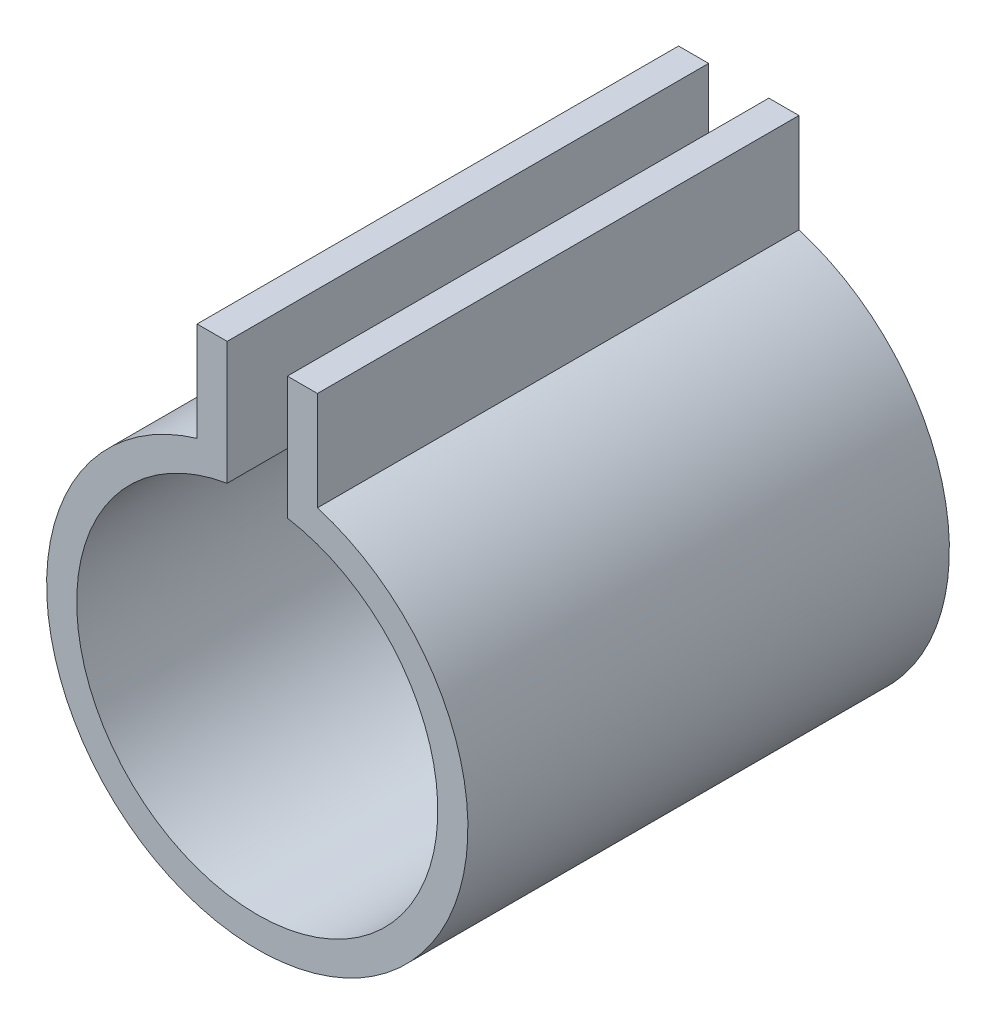
ISO-10303-21;
HEADER;
FILE_DESCRIPTION(('STEP AP214'),'2;1');
FILE_NAME('part.step','',(''),(''),'','','');
FILE_SCHEMA(('AUTOMOTIVE_DESIGN { 1 0 10303 214 1 1 1 1 }'));
ENDSEC;
DATA;
#1=APPLICATION_CONTEXT('core data for automotive mechanical design processes');
#2=APPLICATION_PROTOCOL_DEFINITION('international standard','automotive_design',2000,#1);
#3=PRODUCT_CONTEXT('',#1,'mechanical');
#4=PRODUCT('Part','Part','',(#3));
#5=PRODUCT_RELATED_PRODUCT_CATEGORY('part','',(#4));
#6=PRODUCT_DEFINITION_FORMATION('','',#4);
#7=PRODUCT_DEFINITION_CONTEXT('part definition',#1,'design');
#8=PRODUCT_DEFINITION('design','',#6,#7);
#9=PRODUCT_DEFINITION_SHAPE('','',#8);
#10=(LENGTH_UNIT() NAMED_UNIT(*) SI_UNIT(.MILLI.,.METRE.));
#11=(NAMED_UNIT(*) PLANE_ANGLE_UNIT() SI_UNIT($,.RADIAN.));
#12=(NAMED_UNIT(*) SI_UNIT($,.STERADIAN.) SOLID_ANGLE_UNIT());
#13=UNCERTAINTY_MEASURE_WITH_UNIT(LENGTH_MEASURE(1.E-05),#10,'distance_accuracy_value','');
#14=(GEOMETRIC_REPRESENTATION_CONTEXT(3) GLOBAL_UNCERTAINTY_ASSIGNED_CONTEXT((#13)) GLOBAL_UNIT_ASSIGNED_CONTEXT((#10,
#11,#12)) REPRESENTATION_CONTEXT('',''));
#15=CARTESIAN_POINT('',(0.,0.,0.));
#16=DIRECTION('',(0.,0.,1.));
#17=DIRECTION('',(1.,0.,0.));
#18=AXIS2_PLACEMENT_3D('',#15,#16,#17);
#19=CARTESIAN_POINT('',(-3.175,31.75,50.8));
#20=DIRECTION('',(0.,-1.,0.));
#21=DIRECTION('',(0.,0.,-1.));
#22=AXIS2_PLACEMENT_3D('',#19,#20,#21);
#23=PLANE('',#22);
#24=DIRECTION('',(-1.,0.,0.));
#25=VECTOR('',#24,1.);
#26=CARTESIAN_POINT('',(-3.175,31.75,0.));
#27=LINE('',#26,#25);
#28=CARTESIAN_POINT('',(-3.175,31.75,0.));
#29=VERTEX_POINT('',#28);
#30=CARTESIAN_POINT('',(-6.35,31.75,0.));
#31=VERTEX_POINT('',#30);
#32=EDGE_CURVE('E158',#29,#31,#27,.T.);
#33=ORIENTED_EDGE('',*,*,#32,.T.);
#34=DIRECTION('',(0.,0.,-1.));
#35=VECTOR('',#34,1.);
#36=CARTESIAN_POINT('',(-6.35,31.75,50.8));
#37=LINE('',#36,#35);
#38=CARTESIAN_POINT('',(-6.35,31.75,50.8));
#39=VERTEX_POINT('',#38);
#40=EDGE_CURVE('E11',#39,#31,#37,.T.);
#41=ORIENTED_EDGE('',*,*,#40,.F.);
#42=DIRECTION('',(-1.,0.,0.));
#43=VECTOR('',#42,1.);
#44=CARTESIAN_POINT('',(-3.175,31.75,50.8));
#45=LINE('',#44,#43);
#46=CARTESIAN_POINT('',(-3.175,31.75,50.8));
#47=VERTEX_POINT('',#46);
#48=EDGE_CURVE('E181',#47,#39,#45,.T.);
#49=ORIENTED_EDGE('',*,*,#48,.F.);
#50=DIRECTION('',(0.,0.,-1.));
#51=VECTOR('',#50,1.);
#52=CARTESIAN_POINT('',(-3.175,31.75,50.8));
#53=LINE('',#52,#51);
#54=EDGE_CURVE('E154',#47,#29,#53,.T.);
#55=ORIENTED_EDGE('',*,*,#54,.T.);
#56=EDGE_LOOP('',(#33,#41,#49,#55));
#57=FACE_BOUND('',#56,.T.);
#58=ADVANCED_FACE('F39',(#57),#23,.F.);
#59=CARTESIAN_POINT('',(-6.35,31.75,50.8));
#60=DIRECTION('',(1.,0.,0.));
#61=DIRECTION('',(0.,1.,0.));
#62=AXIS2_PLACEMENT_3D('',#59,#60,#61);
#63=PLANE('',#62);
#64=DIRECTION('',(0.,-1.,0.));
#65=VECTOR('',#64,1.);
#66=CARTESIAN_POINT('',(-6.35,31.75,0.));
#67=LINE('',#66,#65);
#68=CARTESIAN_POINT('',(-6.35,21.2985474856855,0.));
#69=VERTEX_POINT('',#68);
#70=EDGE_CURVE('E162',#31,#69,#67,.T.);
#71=ORIENTED_EDGE('',*,*,#70,.T.);
#72=DIRECTION('',(0.,0.,-1.));
#73=VECTOR('',#72,1.);
#74=CARTESIAN_POINT('',(-6.35,21.2985474856855,50.8));
#75=LINE('',#74,#73);
#76=CARTESIAN_POINT('',(-6.35,21.2985474856855,50.8));
#77=VERTEX_POINT('',#76);
#78=EDGE_CURVE('E48',#77,#69,#75,.T.);
#79=ORIENTED_EDGE('',*,*,#78,.F.);
#80=DIRECTION('',(0.,-1.,0.));
#81=VECTOR('',#80,1.);
#82=CARTESIAN_POINT('',(-6.35,31.75,50.8));
#83=LINE('',#82,#81);
#84=EDGE_CURVE('E110',#39,#77,#83,.T.);
#85=ORIENTED_EDGE('',*,*,#84,.F.);
#86=ORIENTED_EDGE('',*,*,#40,.T.);
#87=EDGE_LOOP('',(#71,#79,#85,#86));
#88=FACE_BOUND('',#87,.T.);
#89=ADVANCED_FACE('F224',(#88),#63,.F.);
#90=CARTESIAN_POINT('',(0.,0.,50.8));
#91=DIRECTION('',(0.,0.,-1.));
#92=DIRECTION('',(-1.,0.,0.));
#93=AXIS2_PLACEMENT_3D('',#90,#91,#92);
#94=CYLINDRICAL_SURFACE('',#93,22.225);
#95=CARTESIAN_POINT('',(0.,0.,0.));
#96=DIRECTION('',(0.,0.,1.));
#97=DIRECTION('',(1.,0.,0.));
#98=AXIS2_PLACEMENT_3D('',#95,#96,#97);
#99=CIRCLE('',#98,22.225);
#100=CARTESIAN_POINT('',(6.35000000000001,21.2985474856855,0.));
#101=VERTEX_POINT('',#100);
#102=EDGE_CURVE('E165',#69,#101,#99,.T.);
#103=ORIENTED_EDGE('',*,*,#102,.T.);
#104=DIRECTION('',(0.,0.,-1.));
#105=VECTOR('',#104,1.);
#106=CARTESIAN_POINT('',(6.35000000000001,21.2985474856855,50.8));
#107=LINE('',#106,#105);
#108=CARTESIAN_POINT('',(6.35000000000001,21.2985474856855,50.8));
#109=VERTEX_POINT('',#108);
#110=EDGE_CURVE('E192',#109,#101,#107,.T.);
#111=ORIENTED_EDGE('',*,*,#110,.F.);
#112=CARTESIAN_POINT('',(0.,0.,50.8));
#113=DIRECTION('',(0.,0.,1.));
#114=DIRECTION('',(1.,0.,0.));
#115=AXIS2_PLACEMENT_3D('',#112,#113,#114);
#116=CIRCLE('',#115,22.225);
#117=EDGE_CURVE('E202',#77,#109,#116,.T.);
#118=ORIENTED_EDGE('',*,*,#117,.F.);
#119=ORIENTED_EDGE('',*,*,#78,.T.);
#120=EDGE_LOOP('',(#103,#111,#118,#119));
#121=FACE_BOUND('',#120,.T.);
#122=ADVANCED_FACE('F200',(#121),#94,.T.);
#123=CARTESIAN_POINT('',(6.35,31.75,50.8));
#124=DIRECTION('',(-1.,0.,0.));
#125=DIRECTION('',(0.,-1.,0.));
#126=AXIS2_PLACEMENT_3D('',#123,#124,#125);
#127=PLANE('',#126);
#128=DIRECTION('',(0.,1.,0.));
#129=VECTOR('',#128,1.);
#130=CARTESIAN_POINT('',(6.35,31.75,0.));
#131=LINE('',#130,#129);
#132=CARTESIAN_POINT('',(6.35,31.75,0.));
#133=VERTEX_POINT('',#132);
#134=EDGE_CURVE('E168',#101,#133,#131,.T.);
#135=ORIENTED_EDGE('',*,*,#134,.T.);
#136=DIRECTION('',(0.,0.,-1.));
#137=VECTOR('',#136,1.);
#138=CARTESIAN_POINT('',(6.35,31.75,50.8));
#139=LINE('',#138,#137);
#140=CARTESIAN_POINT('',(6.35,31.75,50.8));
#141=VERTEX_POINT('',#140);
#142=EDGE_CURVE('E188',#141,#133,#139,.T.);
#143=ORIENTED_EDGE('',*,*,#142,.F.);
#144=DIRECTION('',(0.,1.,0.));
#145=VECTOR('',#144,1.);
#146=CARTESIAN_POINT('',(6.35,31.75,50.8));
#147=LINE('',#146,#145);
#148=EDGE_CURVE('E213',#109,#141,#147,.T.);
#149=ORIENTED_EDGE('',*,*,#148,.F.);
#150=ORIENTED_EDGE('',*,*,#110,.T.);
#151=EDGE_LOOP('',(#135,#143,#149,#150));
#152=FACE_BOUND('',#151,.T.);
#153=ADVANCED_FACE('F208',(#152),#127,.F.);
#154=CARTESIAN_POINT('',(3.175,31.75,50.8));
#155=DIRECTION('',(0.,-1.,0.));
#156=DIRECTION('',(0.,0.,-1.));
#157=AXIS2_PLACEMENT_3D('',#154,#155,#156);
#158=PLANE('',#157);
#159=DIRECTION('',(-1.,0.,0.));
#160=VECTOR('',#159,1.);
#161=CARTESIAN_POINT('',(3.175,31.75,0.));
#162=LINE('',#161,#160);
#163=CARTESIAN_POINT('',(3.175,31.75,0.));
#164=VERTEX_POINT('',#163);
#165=EDGE_CURVE('E171',#133,#164,#162,.T.);
#166=ORIENTED_EDGE('',*,*,#165,.T.);
#167=DIRECTION('',(0.,0.,-1.));
#168=VECTOR('',#167,1.);
#169=CARTESIAN_POINT('',(3.175,31.75,50.8));
#170=LINE('',#169,#168);
#171=CARTESIAN_POINT('',(3.175,31.75,50.8));
#172=VERTEX_POINT('',#171);
#173=EDGE_CURVE('E145',#172,#164,#170,.T.);
#174=ORIENTED_EDGE('',*,*,#173,.F.);
#175=DIRECTION('',(-1.,0.,0.));
#176=VECTOR('',#175,1.);
#177=CARTESIAN_POINT('',(3.175,31.75,50.8));
#178=LINE('',#177,#176);
#179=EDGE_CURVE('E133',#141,#172,#178,.T.);
#180=ORIENTED_EDGE('',*,*,#179,.F.);
#181=ORIENTED_EDGE('',*,*,#142,.T.);
#182=EDGE_LOOP('',(#166,#174,#180,#181));
#183=FACE_BOUND('',#182,.T.);
#184=ADVANCED_FACE('F211',(#183),#158,.F.);
#185=CARTESIAN_POINT('',(3.175,22.86,50.8));
#186=DIRECTION('',(1.,0.,0.));
#187=DIRECTION('',(0.,1.,0.));
#188=AXIS2_PLACEMENT_3D('',#185,#186,#187);
#189=PLANE('',#188);
#190=DIRECTION('',(0.,-1.,0.));
#191=VECTOR('',#190,1.);
#192=CARTESIAN_POINT('',(3.175,22.86,0.));
#193=LINE('',#192,#191);
#194=CARTESIAN_POINT('',(3.175,18.7835533113413,0.));
#195=VERTEX_POINT('',#194);
#196=EDGE_CURVE('E142',#164,#195,#193,.T.);
#197=ORIENTED_EDGE('',*,*,#196,.T.);
#198=DIRECTION('',(0.,0.,-1.));
#199=VECTOR('',#198,1.);
#200=CARTESIAN_POINT('',(3.175,18.7835533113413,50.8));
#201=LINE('',#200,#199);
#202=CARTESIAN_POINT('',(3.175,18.7835533113413,50.8));
#203=VERTEX_POINT('',#202);
#204=EDGE_CURVE('E140',#203,#195,#201,.T.);
#205=ORIENTED_EDGE('',*,*,#204,.F.);
#206=DIRECTION('',(0.,-1.,0.));
#207=VECTOR('',#206,1.);
#208=CARTESIAN_POINT('',(3.175,22.86,50.8));
#209=LINE('',#208,#207);
#210=EDGE_CURVE('E126',#172,#203,#209,.T.);
#211=ORIENTED_EDGE('',*,*,#210,.F.);
#212=ORIENTED_EDGE('',*,*,#173,.T.);
#213=EDGE_LOOP('',(#197,#205,#211,#212));
#214=FACE_BOUND('',#213,.T.);
#215=ADVANCED_FACE('F141',(#214),#189,.F.);
#216=CARTESIAN_POINT('',(0.,0.,50.8));
#217=DIRECTION('',(0.,0.,-1.));
#218=DIRECTION('',(-1.,0.,0.));
#219=AXIS2_PLACEMENT_3D('',#216,#217,#218);
#220=CYLINDRICAL_SURFACE('',#219,19.05);
#221=CARTESIAN_POINT('',(0.,0.,0.));
#222=DIRECTION('',(0.,0.,-1.));
#223=DIRECTION('',(1.,0.,0.));
#224=AXIS2_PLACEMENT_3D('',#221,#222,#223);
#225=CIRCLE('',#224,19.05);
#226=CARTESIAN_POINT('',(-3.175,18.7835533113413,0.));
#227=VERTEX_POINT('',#226);
#228=EDGE_CURVE('E176',#195,#227,#225,.T.);
#229=ORIENTED_EDGE('',*,*,#228,.T.);
#230=DIRECTION('',(0.,0.,-1.));
#231=VECTOR('',#230,1.);
#232=CARTESIAN_POINT('',(-3.175,18.7835533113413,50.8));
#233=LINE('',#232,#231);
#234=CARTESIAN_POINT('',(-3.175,18.7835533113413,50.8));
#235=VERTEX_POINT('',#234);
#236=EDGE_CURVE('E146',#235,#227,#233,.T.);
#237=ORIENTED_EDGE('',*,*,#236,.F.);
#238=CARTESIAN_POINT('',(0.,0.,50.8));
#239=DIRECTION('',(0.,0.,-1.));
#240=DIRECTION('',(1.,0.,0.));
#241=AXIS2_PLACEMENT_3D('',#238,#239,#240);
#242=CIRCLE('',#241,19.05);
#243=EDGE_CURVE('E130',#203,#235,#242,.T.);
#244=ORIENTED_EDGE('',*,*,#243,.F.);
#245=ORIENTED_EDGE('',*,*,#204,.T.);
#246=EDGE_LOOP('',(#229,#237,#244,#245));
#247=FACE_BOUND('',#246,.T.);
#248=ADVANCED_FACE('F148',(#247),#220,.F.);
#249=CARTESIAN_POINT('',(-3.175,22.86,50.8));
#250=DIRECTION('',(-1.,0.,0.));
#251=DIRECTION('',(0.,-1.,0.));
#252=AXIS2_PLACEMENT_3D('',#249,#250,#251);
#253=PLANE('',#252);
#254=DIRECTION('',(0.,1.,0.));
#255=VECTOR('',#254,1.);
#256=CARTESIAN_POINT('',(-3.175,22.86,0.));
#257=LINE('',#256,#255);
#258=EDGE_CURVE('E96',#227,#29,#257,.T.);
#259=ORIENTED_EDGE('',*,*,#258,.T.);
#260=ORIENTED_EDGE('',*,*,#54,.F.);
#261=DIRECTION('',(0.,1.,0.));
#262=VECTOR('',#261,1.);
#263=CARTESIAN_POINT('',(-3.175,22.86,50.8));
#264=LINE('',#263,#262);
#265=EDGE_CURVE('E59',#235,#47,#264,.T.);
#266=ORIENTED_EDGE('',*,*,#265,.F.);
#267=ORIENTED_EDGE('',*,*,#236,.T.);
#268=EDGE_LOOP('',(#259,#260,#266,#267));
#269=FACE_BOUND('',#268,.T.);
#270=ADVANCED_FACE('F240',(#269),#253,.F.);
#271=CARTESIAN_POINT('',(0.,0.,50.8));
#272=DIRECTION('',(0.,0.,1.));
#273=DIRECTION('',(1.,0.,0.));
#274=AXIS2_PLACEMENT_3D('',#271,#272,#273);
#275=PLANE('',#274);
#276=ORIENTED_EDGE('',*,*,#48,.T.);
#277=ORIENTED_EDGE('',*,*,#84,.T.);
#278=ORIENTED_EDGE('',*,*,#117,.T.);
#279=ORIENTED_EDGE('',*,*,#148,.T.);
#280=ORIENTED_EDGE('',*,*,#179,.T.);
#281=ORIENTED_EDGE('',*,*,#210,.T.);
#282=ORIENTED_EDGE('',*,*,#243,.T.);
#283=ORIENTED_EDGE('',*,*,#265,.T.);
#284=EDGE_LOOP('',(#276,#277,#278,#279,#280,#281,#282,#283));
#285=FACE_BOUND('',#284,.T.);
#286=ADVANCED_FACE('F128',(#285),#275,.T.);
#287=CARTESIAN_POINT('',(0.,0.,0.));
#288=DIRECTION('',(0.,0.,1.));
#289=DIRECTION('',(1.,0.,0.));
#290=AXIS2_PLACEMENT_3D('',#287,#288,#289);
#291=PLANE('',#290);
#292=ORIENTED_EDGE('',*,*,#32,.F.);
#293=ORIENTED_EDGE('',*,*,#258,.F.);
#294=ORIENTED_EDGE('',*,*,#228,.F.);
#295=ORIENTED_EDGE('',*,*,#196,.F.);
#296=ORIENTED_EDGE('',*,*,#165,.F.);
#297=ORIENTED_EDGE('',*,*,#134,.F.);
#298=ORIENTED_EDGE('',*,*,#102,.F.);
#299=ORIENTED_EDGE('',*,*,#70,.F.);
#300=EDGE_LOOP('',(#292,#293,#294,#295,#296,#297,#298,#299));
#301=FACE_BOUND('',#300,.T.);
#302=ADVANCED_FACE('F204',(#301),#291,.F.);
#303=CLOSED_SHELL('',(#58,#89,#122,#153,#184,#215,#248,#270,#286,#302));
#304=MANIFOLD_SOLID_BREP('B2',#303);
#305=ADVANCED_BREP_SHAPE_REPRESENTATION('',(#18,#304),#14);
#306=SHAPE_DEFINITION_REPRESENTATION(#9,#305);
ENDSEC;
END-ISO-10303-21;
